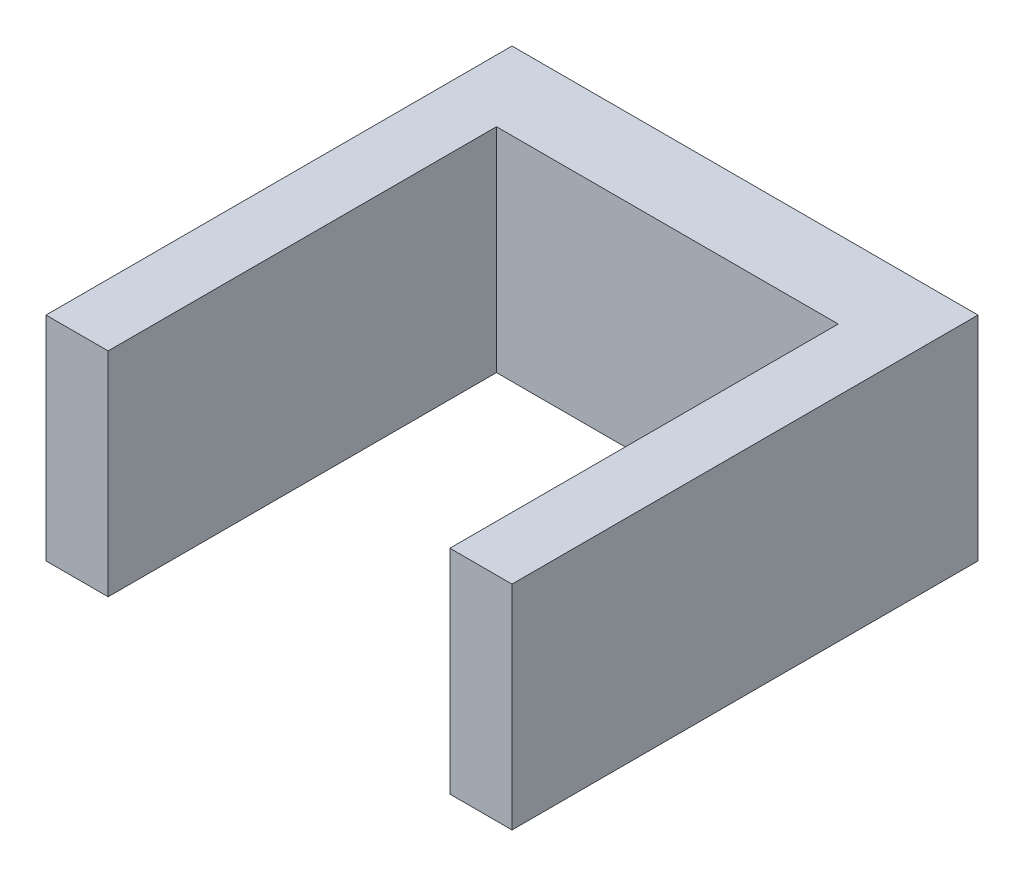
ISO-10303-21;
HEADER;
FILE_DESCRIPTION(('STEP AP214'),'2;1');
FILE_NAME('part.step','',(''),(''),'','','');
FILE_SCHEMA(('AUTOMOTIVE_DESIGN { 1 0 10303 214 1 1 1 1 }'));
ENDSEC;
DATA;
#1=APPLICATION_CONTEXT('core data for automotive mechanical design processes');
#2=APPLICATION_PROTOCOL_DEFINITION('international standard','automotive_design',2000,#1);
#3=PRODUCT_CONTEXT('',#1,'mechanical');
#4=PRODUCT('Part','Part','',(#3));
#5=PRODUCT_RELATED_PRODUCT_CATEGORY('part','',(#4));
#6=PRODUCT_DEFINITION_FORMATION('','',#4);
#7=PRODUCT_DEFINITION_CONTEXT('part definition',#1,'design');
#8=PRODUCT_DEFINITION('design','',#6,#7);
#9=PRODUCT_DEFINITION_SHAPE('','',#8);
#10=(LENGTH_UNIT() NAMED_UNIT(*) SI_UNIT(.MILLI.,.METRE.));
#11=(NAMED_UNIT(*) PLANE_ANGLE_UNIT() SI_UNIT($,.RADIAN.));
#12=(NAMED_UNIT(*) SI_UNIT($,.STERADIAN.) SOLID_ANGLE_UNIT());
#13=UNCERTAINTY_MEASURE_WITH_UNIT(LENGTH_MEASURE(1.E-05),#10,'distance_accuracy_value','');
#14=(GEOMETRIC_REPRESENTATION_CONTEXT(3) GLOBAL_UNCERTAINTY_ASSIGNED_CONTEXT((#13)) GLOBAL_UNIT_ASSIGNED_CONTEXT((#10,
#11,#12)) REPRESENTATION_CONTEXT('',''));
#15=CARTESIAN_POINT('',(0.,0.,0.));
#16=DIRECTION('',(0.,0.,1.));
#17=DIRECTION('',(1.,0.,0.));
#18=AXIS2_PLACEMENT_3D('',#15,#16,#17);
#19=CARTESIAN_POINT('',(4.,13.71,0.));
#20=DIRECTION('',(0.,0.,-1.));
#21=DIRECTION('',(-1.,0.,0.));
#22=AXIS2_PLACEMENT_3D('',#19,#20,#21);
#23=PLANE('',#22);
#24=DIRECTION('',(1.,0.,0.));
#25=VECTOR('',#24,1.);
#26=CARTESIAN_POINT('',(4.,0.,0.));
#27=LINE('',#26,#25);
#28=CARTESIAN_POINT('',(0.,0.,0.));
#29=VERTEX_POINT('',#28);
#30=CARTESIAN_POINT('',(4.,0.,0.));
#31=VERTEX_POINT('',#30);
#32=EDGE_CURVE('E140',#29,#31,#27,.T.);
#33=ORIENTED_EDGE('',*,*,#32,.T.);
#34=DIRECTION('',(0.,-1.,0.));
#35=VECTOR('',#34,1.);
#36=CARTESIAN_POINT('',(4.,13.71,0.));
#37=LINE('',#36,#35);
#38=CARTESIAN_POINT('',(4.,13.71,0.));
#39=VERTEX_POINT('',#38);
#40=EDGE_CURVE('E11',#39,#31,#37,.T.);
#41=ORIENTED_EDGE('',*,*,#40,.F.);
#42=DIRECTION('',(1.,0.,0.));
#43=VECTOR('',#42,1.);
#44=CARTESIAN_POINT('',(4.,13.71,0.));
#45=LINE('',#44,#43);
#46=CARTESIAN_POINT('',(0.,13.71,0.));
#47=VERTEX_POINT('',#46);
#48=EDGE_CURVE('E162',#47,#39,#45,.T.);
#49=ORIENTED_EDGE('',*,*,#48,.F.);
#50=DIRECTION('',(0.,-1.,0.));
#51=VECTOR('',#50,1.);
#52=CARTESIAN_POINT('',(0.,13.71,0.));
#53=LINE('',#52,#51);
#54=EDGE_CURVE('E136',#47,#29,#53,.T.);
#55=ORIENTED_EDGE('',*,*,#54,.T.);
#56=EDGE_LOOP('',(#33,#41,#49,#55));
#57=FACE_BOUND('',#56,.T.);
#58=ADVANCED_FACE('F39',(#57),#23,.F.);
#59=CARTESIAN_POINT('',(4.,13.71,0.));
#60=DIRECTION('',(-1.,0.,0.));
#61=DIRECTION('',(0.,0.,1.));
#62=AXIS2_PLACEMENT_3D('',#59,#60,#61);
#63=PLANE('',#62);
#64=DIRECTION('',(0.,0.,-1.));
#65=VECTOR('',#64,1.);
#66=CARTESIAN_POINT('',(4.,0.,0.));
#67=LINE('',#66,#65);
#68=CARTESIAN_POINT('',(4.,0.,-25.));
#69=VERTEX_POINT('',#68);
#70=EDGE_CURVE('E144',#31,#69,#67,.T.);
#71=ORIENTED_EDGE('',*,*,#70,.T.);
#72=DIRECTION('',(0.,-1.,0.));
#73=VECTOR('',#72,1.);
#74=CARTESIAN_POINT('',(4.,13.71,-25.));
#75=LINE('',#74,#73);
#76=CARTESIAN_POINT('',(4.,13.71,-25.));
#77=VERTEX_POINT('',#76);
#78=EDGE_CURVE('E48',#77,#69,#75,.T.);
#79=ORIENTED_EDGE('',*,*,#78,.F.);
#80=DIRECTION('',(0.,0.,-1.));
#81=VECTOR('',#80,1.);
#82=CARTESIAN_POINT('',(4.,13.71,0.));
#83=LINE('',#82,#81);
#84=EDGE_CURVE('E99',#39,#77,#83,.T.);
#85=ORIENTED_EDGE('',*,*,#84,.F.);
#86=ORIENTED_EDGE('',*,*,#40,.T.);
#87=EDGE_LOOP('',(#71,#79,#85,#86));
#88=FACE_BOUND('',#87,.T.);
#89=ADVANCED_FACE('F208',(#88),#63,.F.);
#90=CARTESIAN_POINT('',(4.,13.71,-25.));
#91=DIRECTION('',(0.,0.,-1.));
#92=DIRECTION('',(-1.,0.,0.));
#93=AXIS2_PLACEMENT_3D('',#90,#91,#92);
#94=PLANE('',#93);
#95=DIRECTION('',(1.,0.,0.));
#96=VECTOR('',#95,1.);
#97=CARTESIAN_POINT('',(4.,0.,-25.));
#98=LINE('',#97,#96);
#99=CARTESIAN_POINT('',(26.,0.,-25.));
#100=VERTEX_POINT('',#99);
#101=EDGE_CURVE('E147',#69,#100,#98,.T.);
#102=ORIENTED_EDGE('',*,*,#101,.T.);
#103=DIRECTION('',(0.,-1.,0.));
#104=VECTOR('',#103,1.);
#105=CARTESIAN_POINT('',(26.,13.71,-25.));
#106=LINE('',#105,#104);
#107=CARTESIAN_POINT('',(26.,13.71,-25.));
#108=VERTEX_POINT('',#107);
#109=EDGE_CURVE('E173',#108,#100,#106,.T.);
#110=ORIENTED_EDGE('',*,*,#109,.F.);
#111=DIRECTION('',(1.,0.,0.));
#112=VECTOR('',#111,1.);
#113=CARTESIAN_POINT('',(4.,13.71,-25.));
#114=LINE('',#113,#112);
#115=EDGE_CURVE('E183',#77,#108,#114,.T.);
#116=ORIENTED_EDGE('',*,*,#115,.F.);
#117=ORIENTED_EDGE('',*,*,#78,.T.);
#118=EDGE_LOOP('',(#102,#110,#116,#117));
#119=FACE_BOUND('',#118,.T.);
#120=ADVANCED_FACE('F181',(#119),#94,.F.);
#121=CARTESIAN_POINT('',(26.,13.71,-25.));
#122=DIRECTION('',(1.,0.,0.));
#123=DIRECTION('',(0.,0.,-1.));
#124=AXIS2_PLACEMENT_3D('',#121,#122,#123);
#125=PLANE('',#124);
#126=DIRECTION('',(0.,0.,1.));
#127=VECTOR('',#126,1.);
#128=CARTESIAN_POINT('',(26.,0.,-25.));
#129=LINE('',#128,#127);
#130=CARTESIAN_POINT('',(26.,0.,0.));
#131=VERTEX_POINT('',#130);
#132=EDGE_CURVE('E150',#100,#131,#129,.T.);
#133=ORIENTED_EDGE('',*,*,#132,.T.);
#134=DIRECTION('',(0.,-1.,0.));
#135=VECTOR('',#134,1.);
#136=CARTESIAN_POINT('',(26.,13.71,0.));
#137=LINE('',#136,#135);
#138=CARTESIAN_POINT('',(26.,13.71,0.));
#139=VERTEX_POINT('',#138);
#140=EDGE_CURVE('E169',#139,#131,#137,.T.);
#141=ORIENTED_EDGE('',*,*,#140,.F.);
#142=DIRECTION('',(0.,0.,1.));
#143=VECTOR('',#142,1.);
#144=CARTESIAN_POINT('',(26.,13.71,-25.));
#145=LINE('',#144,#143);
#146=EDGE_CURVE('E196',#108,#139,#145,.T.);
#147=ORIENTED_EDGE('',*,*,#146,.F.);
#148=ORIENTED_EDGE('',*,*,#109,.T.);
#149=EDGE_LOOP('',(#133,#141,#147,#148));
#150=FACE_BOUND('',#149,.T.);
#151=ADVANCED_FACE('F191',(#150),#125,.F.);
#152=CARTESIAN_POINT('',(30.,13.71,0.));
#153=DIRECTION('',(0.,0.,-1.));
#154=DIRECTION('',(-1.,0.,0.));
#155=AXIS2_PLACEMENT_3D('',#152,#153,#154);
#156=PLANE('',#155);
#157=DIRECTION('',(1.,0.,0.));
#158=VECTOR('',#157,1.);
#159=CARTESIAN_POINT('',(30.,0.,0.));
#160=LINE('',#159,#158);
#161=CARTESIAN_POINT('',(30.,0.,0.));
#162=VERTEX_POINT('',#161);
#163=EDGE_CURVE('E153',#131,#162,#160,.T.);
#164=ORIENTED_EDGE('',*,*,#163,.T.);
#165=DIRECTION('',(0.,-1.,0.));
#166=VECTOR('',#165,1.);
#167=CARTESIAN_POINT('',(30.,13.71,0.));
#168=LINE('',#167,#166);
#169=CARTESIAN_POINT('',(30.,13.71,0.));
#170=VERTEX_POINT('',#169);
#171=EDGE_CURVE('E129',#170,#162,#168,.T.);
#172=ORIENTED_EDGE('',*,*,#171,.F.);
#173=DIRECTION('',(1.,0.,0.));
#174=VECTOR('',#173,1.);
#175=CARTESIAN_POINT('',(30.,13.71,0.));
#176=LINE('',#175,#174);
#177=EDGE_CURVE('E118',#139,#170,#176,.T.);
#178=ORIENTED_EDGE('',*,*,#177,.F.);
#179=ORIENTED_EDGE('',*,*,#140,.T.);
#180=EDGE_LOOP('',(#164,#172,#178,#179));
#181=FACE_BOUND('',#180,.T.);
#182=ADVANCED_FACE('F194',(#181),#156,.F.);
#183=CARTESIAN_POINT('',(30.,13.71,-30.));
#184=DIRECTION('',(-1.,0.,0.));
#185=DIRECTION('',(0.,0.,1.));
#186=AXIS2_PLACEMENT_3D('',#183,#184,#185);
#187=PLANE('',#186);
#188=DIRECTION('',(0.,0.,-1.));
#189=VECTOR('',#188,1.);
#190=CARTESIAN_POINT('',(30.,0.,-30.));
#191=LINE('',#190,#189);
#192=CARTESIAN_POINT('',(30.,0.,-30.));
#193=VERTEX_POINT('',#192);
#194=EDGE_CURVE('E127',#162,#193,#191,.T.);
#195=ORIENTED_EDGE('',*,*,#194,.T.);
#196=DIRECTION('',(0.,-1.,0.));
#197=VECTOR('',#196,1.);
#198=CARTESIAN_POINT('',(30.,13.71,-30.));
#199=LINE('',#198,#197);
#200=CARTESIAN_POINT('',(30.,13.71,-30.));
#201=VERTEX_POINT('',#200);
#202=EDGE_CURVE('E124',#201,#193,#199,.T.);
#203=ORIENTED_EDGE('',*,*,#202,.F.);
#204=DIRECTION('',(0.,0.,-1.));
#205=VECTOR('',#204,1.);
#206=CARTESIAN_POINT('',(30.,13.71,-30.));
#207=LINE('',#206,#205);
#208=EDGE_CURVE('E112',#170,#201,#207,.T.);
#209=ORIENTED_EDGE('',*,*,#208,.F.);
#210=ORIENTED_EDGE('',*,*,#171,.T.);
#211=EDGE_LOOP('',(#195,#203,#209,#210));
#212=FACE_BOUND('',#211,.T.);
#213=ADVANCED_FACE('F125',(#212),#187,.F.);
#214=CARTESIAN_POINT('',(0.,13.71,-30.));
#215=DIRECTION('',(0.,0.,1.));
#216=DIRECTION('',(1.,0.,0.));
#217=AXIS2_PLACEMENT_3D('',#214,#215,#216);
#218=PLANE('',#217);
#219=DIRECTION('',(-1.,0.,0.));
#220=VECTOR('',#219,1.);
#221=CARTESIAN_POINT('',(0.,0.,-30.));
#222=LINE('',#221,#220);
#223=CARTESIAN_POINT('',(0.,0.,-30.));
#224=VERTEX_POINT('',#223);
#225=EDGE_CURVE('E85',#193,#224,#222,.T.);
#226=ORIENTED_EDGE('',*,*,#225,.T.);
#227=DIRECTION('',(0.,-1.,0.));
#228=VECTOR('',#227,1.);
#229=CARTESIAN_POINT('',(0.,13.71,-30.));
#230=LINE('',#229,#228);
#231=CARTESIAN_POINT('',(0.,13.71,-30.));
#232=VERTEX_POINT('',#231);
#233=EDGE_CURVE('E130',#232,#224,#230,.T.);
#234=ORIENTED_EDGE('',*,*,#233,.F.);
#235=DIRECTION('',(-1.,0.,0.));
#236=VECTOR('',#235,1.);
#237=CARTESIAN_POINT('',(0.,13.71,-30.));
#238=LINE('',#237,#236);
#239=EDGE_CURVE('E116',#201,#232,#238,.T.);
#240=ORIENTED_EDGE('',*,*,#239,.F.);
#241=ORIENTED_EDGE('',*,*,#202,.T.);
#242=EDGE_LOOP('',(#226,#234,#240,#241));
#243=FACE_BOUND('',#242,.T.);
#244=ADVANCED_FACE('F132',(#243),#218,.F.);
#245=CARTESIAN_POINT('',(0.,13.71,0.));
#246=DIRECTION('',(1.,0.,0.));
#247=DIRECTION('',(0.,0.,-1.));
#248=AXIS2_PLACEMENT_3D('',#245,#246,#247);
#249=PLANE('',#248);
#250=DIRECTION('',(0.,0.,1.));
#251=VECTOR('',#250,1.);
#252=CARTESIAN_POINT('',(0.,0.,0.));
#253=LINE('',#252,#251);
#254=EDGE_CURVE('E91',#224,#29,#253,.T.);
#255=ORIENTED_EDGE('',*,*,#254,.T.);
#256=ORIENTED_EDGE('',*,*,#54,.F.);
#257=DIRECTION('',(0.,0.,1.));
#258=VECTOR('',#257,1.);
#259=CARTESIAN_POINT('',(0.,13.71,0.));
#260=LINE('',#259,#258);
#261=EDGE_CURVE('E56',#232,#47,#260,.T.);
#262=ORIENTED_EDGE('',*,*,#261,.F.);
#263=ORIENTED_EDGE('',*,*,#233,.T.);
#264=EDGE_LOOP('',(#255,#256,#262,#263));
#265=FACE_BOUND('',#264,.T.);
#266=ADVANCED_FACE('F224',(#265),#249,.F.);
#267=CARTESIAN_POINT('',(0.,13.71,0.));
#268=DIRECTION('',(0.,-1.,0.));
#269=DIRECTION('',(0.,0.,-1.));
#270=AXIS2_PLACEMENT_3D('',#267,#268,#269);
#271=PLANE('',#270);
#272=ORIENTED_EDGE('',*,*,#48,.T.);
#273=ORIENTED_EDGE('',*,*,#84,.T.);
#274=ORIENTED_EDGE('',*,*,#115,.T.);
#275=ORIENTED_EDGE('',*,*,#146,.T.);
#276=ORIENTED_EDGE('',*,*,#177,.T.);
#277=ORIENTED_EDGE('',*,*,#208,.T.);
#278=ORIENTED_EDGE('',*,*,#239,.T.);
#279=ORIENTED_EDGE('',*,*,#261,.T.);
#280=EDGE_LOOP('',(#272,#273,#274,#275,#276,#277,#278,#279));
#281=FACE_BOUND('',#280,.T.);
#282=ADVANCED_FACE('F114',(#281),#271,.F.);
#283=CARTESIAN_POINT('',(0.,0.,0.));
#284=DIRECTION('',(0.,-1.,0.));
#285=DIRECTION('',(0.,0.,-1.));
#286=AXIS2_PLACEMENT_3D('',#283,#284,#285);
#287=PLANE('',#286);
#288=ORIENTED_EDGE('',*,*,#32,.F.);
#289=ORIENTED_EDGE('',*,*,#254,.F.);
#290=ORIENTED_EDGE('',*,*,#225,.F.);
#291=ORIENTED_EDGE('',*,*,#194,.F.);
#292=ORIENTED_EDGE('',*,*,#163,.F.);
#293=ORIENTED_EDGE('',*,*,#132,.F.);
#294=ORIENTED_EDGE('',*,*,#101,.F.);
#295=ORIENTED_EDGE('',*,*,#70,.F.);
#296=EDGE_LOOP('',(#288,#289,#290,#291,#292,#293,#294,#295));
#297=FACE_BOUND('',#296,.T.);
#298=ADVANCED_FACE('F187',(#297),#287,.T.);
#299=CLOSED_SHELL('',(#58,#89,#120,#151,#182,#213,#244,#266,#282,#298));
#300=MANIFOLD_SOLID_BREP('B2',#299);
#301=ADVANCED_BREP_SHAPE_REPRESENTATION('',(#18,#300),#14);
#302=SHAPE_DEFINITION_REPRESENTATION(#9,#301);
ENDSEC;
END-ISO-10303-21;
